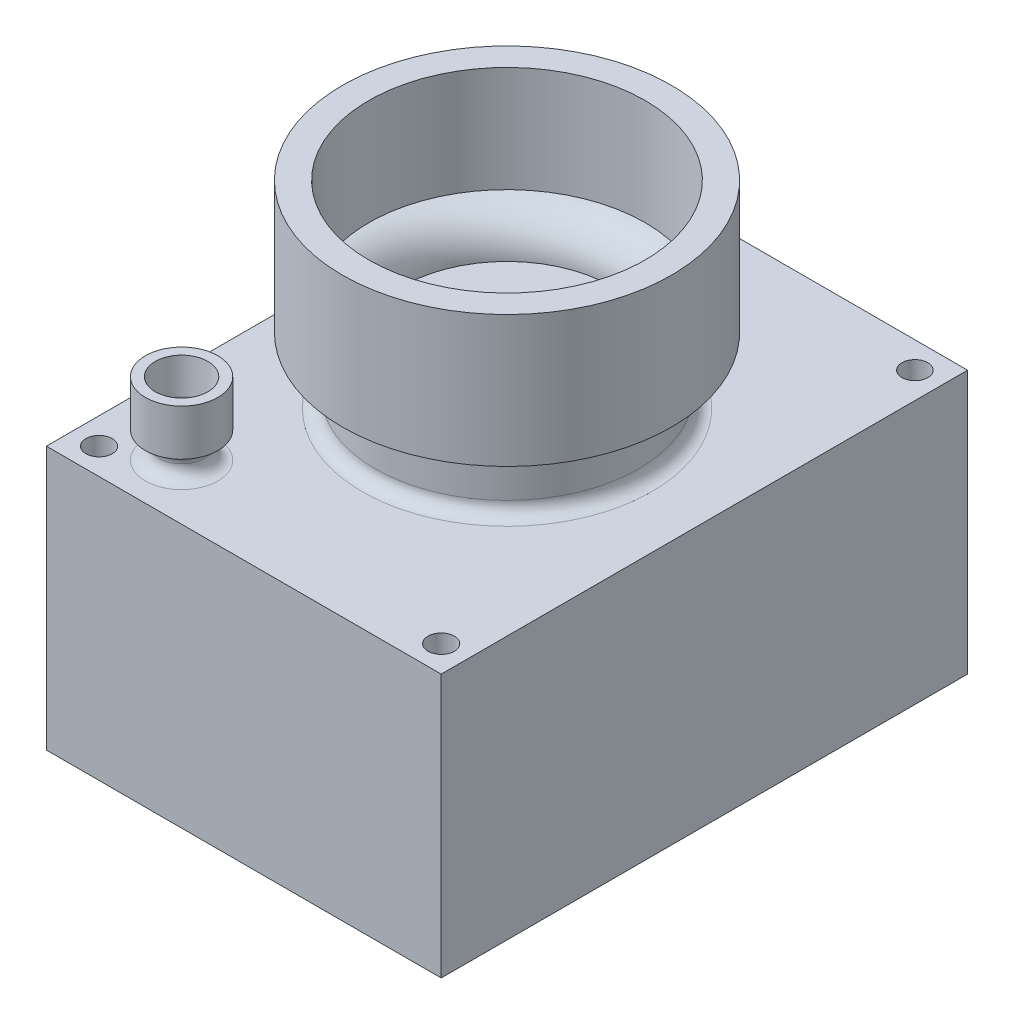
ISO-10303-21;
HEADER;
FILE_DESCRIPTION(('STEP AP214'),'2;1');
FILE_NAME('part.step','',(''),(''),'','','');
FILE_SCHEMA(('AUTOMOTIVE_DESIGN { 1 0 10303 214 1 1 1 1 }'));
ENDSEC;
DATA;
#1=APPLICATION_CONTEXT('core data for automotive mechanical design processes');
#2=APPLICATION_PROTOCOL_DEFINITION('international standard','automotive_design',2000,#1);
#3=PRODUCT_CONTEXT('',#1,'mechanical');
#4=PRODUCT('Part','Part','',(#3));
#5=PRODUCT_RELATED_PRODUCT_CATEGORY('part','',(#4));
#6=PRODUCT_DEFINITION_FORMATION('','',#4);
#7=PRODUCT_DEFINITION_CONTEXT('part definition',#1,'design');
#8=PRODUCT_DEFINITION('design','',#6,#7);
#9=PRODUCT_DEFINITION_SHAPE('','',#8);
#10=(LENGTH_UNIT() NAMED_UNIT(*) SI_UNIT(.MILLI.,.METRE.));
#11=(NAMED_UNIT(*) PLANE_ANGLE_UNIT() SI_UNIT($,.RADIAN.));
#12=(NAMED_UNIT(*) SI_UNIT($,.STERADIAN.) SOLID_ANGLE_UNIT());
#13=UNCERTAINTY_MEASURE_WITH_UNIT(LENGTH_MEASURE(1.E-05),#10,'distance_accuracy_value','');
#14=(GEOMETRIC_REPRESENTATION_CONTEXT(3) GLOBAL_UNCERTAINTY_ASSIGNED_CONTEXT((#13)) GLOBAL_UNIT_ASSIGNED_CONTEXT((#10,
#11,#12)) REPRESENTATION_CONTEXT('',''));
#15=CARTESIAN_POINT('',(0.,0.,0.));
#16=DIRECTION('',(0.,0.,1.));
#17=DIRECTION('',(1.,0.,0.));
#18=AXIS2_PLACEMENT_3D('',#15,#16,#17);
#19=CARTESIAN_POINT('',(0.,60.9600000947775,0.));
#20=DIRECTION('',(0.,-1.,0.));
#21=DIRECTION('',(0.,0.,-1.));
#22=AXIS2_PLACEMENT_3D('',#19,#20,#21);
#23=PLANE('',#22);
#24=CARTESIAN_POINT('',(0.,60.9600000947775,0.));
#25=DIRECTION('',(0.,-1.,0.));
#26=DIRECTION('',(0.,0.,-1.));
#27=AXIS2_PLACEMENT_3D('',#24,#25,#26);
#28=CIRCLE('',#27,20.32);
#29=CARTESIAN_POINT('',(0.,60.9600000947775,-20.32));
#30=VERTEX_POINT('',#29);
#31=EDGE_CURVE('E13',#30,#30,#28,.T.);
#32=ORIENTED_EDGE('',*,*,#31,.T.);
#33=EDGE_LOOP('',(#32));
#34=FACE_BOUND('',#33,.T.);
#35=ADVANCED_FACE('F49',(#34),#23,.T.);
#36=OPEN_SHELL('',(#35));
#37=SHELL_BASED_SURFACE_MODEL('B2',(#36));
#38=CARTESIAN_POINT('',(38.1,50.8,50.8));
#39=DIRECTION('',(-1.,0.,0.));
#40=DIRECTION('',(0.,0.,1.));
#41=AXIS2_PLACEMENT_3D('',#38,#39,#40);
#42=PLANE('',#41);
#43=DIRECTION('',(0.,0.,-1.));
#44=VECTOR('',#43,1.);
#45=CARTESIAN_POINT('',(38.1,0.,50.8));
#46=LINE('',#45,#44);
#47=CARTESIAN_POINT('',(38.1,0.,50.8));
#48=VERTEX_POINT('',#47);
#49=CARTESIAN_POINT('',(38.1,0.,-50.8));
#50=VERTEX_POINT('',#49);
#51=EDGE_CURVE('E208',#48,#50,#46,.T.);
#52=ORIENTED_EDGE('',*,*,#51,.T.);
#53=DIRECTION('',(0.,-1.,0.));
#54=VECTOR('',#53,1.);
#55=CARTESIAN_POINT('',(38.1,50.8,-50.8));
#56=LINE('',#55,#54);
#57=CARTESIAN_POINT('',(38.1,50.8,-50.8));
#58=VERTEX_POINT('',#57);
#59=EDGE_CURVE('E237',#58,#50,#56,.T.);
#60=ORIENTED_EDGE('',*,*,#59,.F.);
#61=DIRECTION('',(0.,0.,-1.));
#62=VECTOR('',#61,1.);
#63=CARTESIAN_POINT('',(38.1,50.8,50.8));
#64=LINE('',#63,#62);
#65=CARTESIAN_POINT('',(38.1,50.8,50.8));
#66=VERTEX_POINT('',#65);
#67=EDGE_CURVE('E211',#66,#58,#64,.T.);
#68=ORIENTED_EDGE('',*,*,#67,.F.);
#69=DIRECTION('',(0.,-1.,0.));
#70=VECTOR('',#69,1.);
#71=CARTESIAN_POINT('',(38.1,50.8,50.8));
#72=LINE('',#71,#70);
#73=EDGE_CURVE('E221',#66,#48,#72,.T.);
#74=ORIENTED_EDGE('',*,*,#73,.T.);
#75=EDGE_LOOP('',(#52,#60,#68,#74));
#76=FACE_BOUND('',#75,.T.);
#77=ADVANCED_FACE('F67',(#76),#42,.F.);
#78=CARTESIAN_POINT('',(-38.1,50.8,-50.8));
#79=DIRECTION('',(0.,0.,1.));
#80=DIRECTION('',(1.,0.,0.));
#81=AXIS2_PLACEMENT_3D('',#78,#79,#80);
#82=PLANE('',#81);
#83=DIRECTION('',(-1.,0.,0.));
#84=VECTOR('',#83,1.);
#85=CARTESIAN_POINT('',(-38.1,0.,-50.8));
#86=LINE('',#85,#84);
#87=CARTESIAN_POINT('',(-38.1,0.,-50.8));
#88=VERTEX_POINT('',#87);
#89=EDGE_CURVE('E224',#50,#88,#86,.T.);
#90=ORIENTED_EDGE('',*,*,#89,.T.);
#91=DIRECTION('',(0.,-1.,0.));
#92=VECTOR('',#91,1.);
#93=CARTESIAN_POINT('',(-38.1,50.8,-50.8));
#94=LINE('',#93,#92);
#95=CARTESIAN_POINT('',(-38.1,50.8,-50.8));
#96=VERTEX_POINT('',#95);
#97=EDGE_CURVE('E234',#96,#88,#94,.T.);
#98=ORIENTED_EDGE('',*,*,#97,.F.);
#99=DIRECTION('',(-1.,0.,0.));
#100=VECTOR('',#99,1.);
#101=CARTESIAN_POINT('',(-38.1,50.8,-50.8));
#102=LINE('',#101,#100);
#103=EDGE_CURVE('E214',#58,#96,#102,.T.);
#104=ORIENTED_EDGE('',*,*,#103,.F.);
#105=ORIENTED_EDGE('',*,*,#59,.T.);
#106=EDGE_LOOP('',(#90,#98,#104,#105));
#107=FACE_BOUND('',#106,.T.);
#108=ADVANCED_FACE('F279',(#107),#82,.F.);
#109=CARTESIAN_POINT('',(-38.1,50.8,50.8));
#110=DIRECTION('',(1.,0.,0.));
#111=DIRECTION('',(0.,0.,-1.));
#112=AXIS2_PLACEMENT_3D('',#109,#110,#111);
#113=PLANE('',#112);
#114=DIRECTION('',(0.,0.,1.));
#115=VECTOR('',#114,1.);
#116=CARTESIAN_POINT('',(-38.1,0.,50.8));
#117=LINE('',#116,#115);
#118=CARTESIAN_POINT('',(-38.1,0.,50.8));
#119=VERTEX_POINT('',#118);
#120=EDGE_CURVE('E226',#88,#119,#117,.T.);
#121=ORIENTED_EDGE('',*,*,#120,.T.);
#122=DIRECTION('',(0.,-1.,0.));
#123=VECTOR('',#122,1.);
#124=CARTESIAN_POINT('',(-38.1,50.8,50.8));
#125=LINE('',#124,#123);
#126=CARTESIAN_POINT('',(-38.1,50.8,50.8));
#127=VERTEX_POINT('',#126);
#128=EDGE_CURVE('E231',#127,#119,#125,.T.);
#129=ORIENTED_EDGE('',*,*,#128,.F.);
#130=DIRECTION('',(0.,0.,1.));
#131=VECTOR('',#130,1.);
#132=CARTESIAN_POINT('',(-38.1,50.8,50.8));
#133=LINE('',#132,#131);
#134=EDGE_CURVE('E217',#96,#127,#133,.T.);
#135=ORIENTED_EDGE('',*,*,#134,.F.);
#136=ORIENTED_EDGE('',*,*,#97,.T.);
#137=EDGE_LOOP('',(#121,#129,#135,#136));
#138=FACE_BOUND('',#137,.T.);
#139=ADVANCED_FACE('F286',(#138),#113,.F.);
#140=CARTESIAN_POINT('',(-38.1,50.8,50.8));
#141=DIRECTION('',(0.,0.,-1.));
#142=DIRECTION('',(-1.,0.,0.));
#143=AXIS2_PLACEMENT_3D('',#140,#141,#142);
#144=PLANE('',#143);
#145=DIRECTION('',(1.,0.,0.));
#146=VECTOR('',#145,1.);
#147=CARTESIAN_POINT('',(-38.1,0.,50.8));
#148=LINE('',#147,#146);
#149=EDGE_CURVE('E215',#119,#48,#148,.T.);
#150=ORIENTED_EDGE('',*,*,#149,.T.);
#151=ORIENTED_EDGE('',*,*,#73,.F.);
#152=DIRECTION('',(1.,0.,0.));
#153=VECTOR('',#152,1.);
#154=CARTESIAN_POINT('',(-38.1,50.8,50.8));
#155=LINE('',#154,#153);
#156=EDGE_CURVE('E219',#127,#66,#155,.T.);
#157=ORIENTED_EDGE('',*,*,#156,.F.);
#158=ORIENTED_EDGE('',*,*,#128,.T.);
#159=EDGE_LOOP('',(#150,#151,#157,#158));
#160=FACE_BOUND('',#159,.T.);
#161=ADVANCED_FACE('F400',(#160),#144,.F.);
#162=CARTESIAN_POINT('',(0.,50.8,0.));
#163=DIRECTION('',(0.,-1.,0.));
#164=DIRECTION('',(0.,0.,-1.));
#165=AXIS2_PLACEMENT_3D('',#162,#163,#164);
#166=PLANE('',#165);
#167=CARTESIAN_POINT('',(-22.7138732996143,50.8,40.0934278697737));
#168=DIRECTION('',(0.,-1.,0.));
#169=DIRECTION('',(0.,0.,-1.));
#170=AXIS2_PLACEMENT_3D('',#167,#168,#169);
#171=CIRCLE('',#170,6.985);
#172=CARTESIAN_POINT('',(-22.7138732996143,50.8,33.1084278697737));
#173=VERTEX_POINT('',#172);
#174=EDGE_CURVE('E261',#173,#173,#171,.T.);
#175=ORIENTED_EDGE('',*,*,#174,.T.);
#176=EDGE_LOOP('',(#175));
#177=FACE_BOUND('',#176,.T.);
#178=CARTESIAN_POINT('',(33.0128049647438,50.8,45.72));
#179=DIRECTION('',(0.,1.,0.));
#180=DIRECTION('',(0.,0.,1.));
#181=AXIS2_PLACEMENT_3D('',#178,#179,#180);
#182=CIRCLE('',#181,2.54);
#183=CARTESIAN_POINT('',(33.0128049647438,50.8,48.26));
#184=VERTEX_POINT('',#183);
#185=EDGE_CURVE('E321',#184,#184,#182,.T.);
#186=ORIENTED_EDGE('',*,*,#185,.F.);
#187=EDGE_LOOP('',(#186));
#188=FACE_BOUND('',#187,.T.);
#189=CARTESIAN_POINT('',(-33.02,50.8,45.72));
#190=DIRECTION('',(0.,1.,0.));
#191=DIRECTION('',(0.,0.,1.));
#192=AXIS2_PLACEMENT_3D('',#189,#190,#191);
#193=CIRCLE('',#192,2.54);
#194=CARTESIAN_POINT('',(-33.02,50.8,48.26));
#195=VERTEX_POINT('',#194);
#196=EDGE_CURVE('E333',#195,#195,#193,.T.);
#197=ORIENTED_EDGE('',*,*,#196,.F.);
#198=EDGE_LOOP('',(#197));
#199=FACE_BOUND('',#198,.T.);
#200=CARTESIAN_POINT('',(33.0128049647438,50.8,-45.72));
#201=DIRECTION('',(0.,1.,0.));
#202=DIRECTION('',(0.,0.,1.));
#203=AXIS2_PLACEMENT_3D('',#200,#201,#202);
#204=CIRCLE('',#203,2.49811005626827);
#205=CARTESIAN_POINT('',(33.0128049647438,50.8,-43.2218899437317));
#206=VERTEX_POINT('',#205);
#207=EDGE_CURVE('E344',#206,#206,#204,.T.);
#208=ORIENTED_EDGE('',*,*,#207,.F.);
#209=EDGE_LOOP('',(#208));
#210=FACE_BOUND('',#209,.T.);
#211=CARTESIAN_POINT('',(-33.02,50.8,-45.72));
#212=DIRECTION('',(0.,1.,0.));
#213=DIRECTION('',(0.,0.,1.));
#214=AXIS2_PLACEMENT_3D('',#211,#212,#213);
#215=CIRCLE('',#214,2.54);
#216=CARTESIAN_POINT('',(-33.02,50.8,-43.18));
#217=VERTEX_POINT('',#216);
#218=EDGE_CURVE('E357',#217,#217,#215,.T.);
#219=ORIENTED_EDGE('',*,*,#218,.F.);
#220=EDGE_LOOP('',(#219));
#221=FACE_BOUND('',#220,.T.);
#222=CARTESIAN_POINT('',(0.,50.8,0.));
#223=DIRECTION('',(0.,-1.,0.));
#224=DIRECTION('',(0.,0.,-1.));
#225=AXIS2_PLACEMENT_3D('',#222,#223,#224);
#226=CIRCLE('',#225,27.94);
#227=CARTESIAN_POINT('',(0.,50.8,-27.94));
#228=VERTEX_POINT('',#227);
#229=EDGE_CURVE('E243',#228,#228,#226,.T.);
#230=ORIENTED_EDGE('',*,*,#229,.T.);
#231=EDGE_LOOP('',(#230));
#232=FACE_BOUND('',#231,.T.);
#233=ORIENTED_EDGE('',*,*,#67,.T.);
#234=ORIENTED_EDGE('',*,*,#103,.T.);
#235=ORIENTED_EDGE('',*,*,#134,.T.);
#236=ORIENTED_EDGE('',*,*,#156,.T.);
#237=EDGE_LOOP('',(#233,#234,#235,#236));
#238=FACE_BOUND('',#237,.T.);
#239=ADVANCED_FACE('F396',(#177,#188,#199,#210,#221,#232,#238),#166,.F.);
#240=CARTESIAN_POINT('',(0.,0.,0.));
#241=DIRECTION('',(0.,-1.,0.));
#242=DIRECTION('',(0.,0.,-1.));
#243=AXIS2_PLACEMENT_3D('',#240,#241,#242);
#244=PLANE('',#243);
#245=CARTESIAN_POINT('',(33.0128049647438,0.,45.72));
#246=DIRECTION('',(0.,1.,0.));
#247=DIRECTION('',(0.,0.,1.));
#248=AXIS2_PLACEMENT_3D('',#245,#246,#247);
#249=CIRCLE('',#248,2.54);
#250=CARTESIAN_POINT('',(33.0128049647438,0.,48.26));
#251=VERTEX_POINT('',#250);
#252=EDGE_CURVE('E172',#251,#251,#249,.T.);
#253=ORIENTED_EDGE('',*,*,#252,.T.);
#254=EDGE_LOOP('',(#253));
#255=FACE_BOUND('',#254,.T.);
#256=CARTESIAN_POINT('',(-33.02,0.,45.72));
#257=DIRECTION('',(0.,1.,0.));
#258=DIRECTION('',(0.,0.,1.));
#259=AXIS2_PLACEMENT_3D('',#256,#257,#258);
#260=CIRCLE('',#259,2.54);
#261=CARTESIAN_POINT('',(-33.02,0.,48.26));
#262=VERTEX_POINT('',#261);
#263=EDGE_CURVE('E334',#262,#262,#260,.T.);
#264=ORIENTED_EDGE('',*,*,#263,.T.);
#265=EDGE_LOOP('',(#264));
#266=FACE_BOUND('',#265,.T.);
#267=CARTESIAN_POINT('',(33.0128049647438,0.,-45.72));
#268=DIRECTION('',(0.,1.,0.));
#269=DIRECTION('',(0.,0.,1.));
#270=AXIS2_PLACEMENT_3D('',#267,#268,#269);
#271=CIRCLE('',#270,2.49811005626827);
#272=CARTESIAN_POINT('',(33.0128049647438,0.,-43.2218899437317));
#273=VERTEX_POINT('',#272);
#274=EDGE_CURVE('E345',#273,#273,#271,.T.);
#275=ORIENTED_EDGE('',*,*,#274,.T.);
#276=EDGE_LOOP('',(#275));
#277=FACE_BOUND('',#276,.T.);
#278=CARTESIAN_POINT('',(-33.02,0.,-45.72));
#279=DIRECTION('',(0.,1.,0.));
#280=DIRECTION('',(0.,0.,1.));
#281=AXIS2_PLACEMENT_3D('',#278,#279,#280);
#282=CIRCLE('',#281,2.54);
#283=CARTESIAN_POINT('',(-33.02,0.,-43.18));
#284=VERTEX_POINT('',#283);
#285=EDGE_CURVE('E358',#284,#284,#282,.T.);
#286=ORIENTED_EDGE('',*,*,#285,.T.);
#287=EDGE_LOOP('',(#286));
#288=FACE_BOUND('',#287,.T.);
#289=ORIENTED_EDGE('',*,*,#51,.F.);
#290=ORIENTED_EDGE('',*,*,#149,.F.);
#291=ORIENTED_EDGE('',*,*,#120,.F.);
#292=ORIENTED_EDGE('',*,*,#89,.F.);
#293=EDGE_LOOP('',(#289,#290,#291,#292));
#294=FACE_BOUND('',#293,.T.);
#295=ADVANCED_FACE('F399',(#255,#266,#277,#288,#294),#244,.T.);
#296=CARTESIAN_POINT('',(0.,63.5,0.));
#297=DIRECTION('',(0.,-1.,0.));
#298=DIRECTION('',(0.,0.,-1.));
#299=AXIS2_PLACEMENT_3D('',#296,#297,#298);
#300=CYLINDRICAL_SURFACE('',#299,25.4);
#301=CARTESIAN_POINT('',(0.,60.96,0.));
#302=DIRECTION('',(0.,1.,0.));
#303=DIRECTION('',(0.,0.,1.));
#304=AXIS2_PLACEMENT_3D('',#301,#302,#303);
#305=CIRCLE('',#304,25.4);
#306=CARTESIAN_POINT('',(0.,60.96,25.4));
#307=VERTEX_POINT('',#306);
#308=EDGE_CURVE('E249',#307,#307,#305,.F.);
#309=ORIENTED_EDGE('',*,*,#308,.T.);
#310=EDGE_LOOP('',(#309));
#311=FACE_BOUND('',#310,.T.);
#312=CARTESIAN_POINT('',(0.,53.34,0.));
#313=DIRECTION('',(0.,-1.,0.));
#314=DIRECTION('',(0.,0.,-1.));
#315=AXIS2_PLACEMENT_3D('',#312,#313,#314);
#316=CIRCLE('',#315,25.4);
#317=CARTESIAN_POINT('',(0.,53.34,-25.4));
#318=VERTEX_POINT('',#317);
#319=EDGE_CURVE('E240',#318,#318,#316,.F.);
#320=ORIENTED_EDGE('',*,*,#319,.T.);
#321=EDGE_LOOP('',(#320));
#322=FACE_BOUND('',#321,.T.);
#323=ADVANCED_FACE('F423',(#311,#322),#300,.T.);
#324=CARTESIAN_POINT('',(0.,88.9,0.));
#325=DIRECTION('',(0.,-1.,0.));
#326=DIRECTION('',(0.,0.,-1.));
#327=AXIS2_PLACEMENT_3D('',#324,#325,#326);
#328=CYLINDRICAL_SURFACE('',#327,31.75);
#329=CARTESIAN_POINT('',(0.,88.9,0.));
#330=DIRECTION('',(0.,1.,0.));
#331=DIRECTION('',(0.,0.,1.));
#332=AXIS2_PLACEMENT_3D('',#329,#330,#331);
#333=CIRCLE('',#332,31.75);
#334=CARTESIAN_POINT('',(0.,88.9,31.75));
#335=VERTEX_POINT('',#334);
#336=EDGE_CURVE('E205',#335,#335,#333,.T.);
#337=ORIENTED_EDGE('',*,*,#336,.F.);
#338=EDGE_LOOP('',(#337));
#339=FACE_BOUND('',#338,.T.);
#340=CARTESIAN_POINT('',(0.,63.5,0.));
#341=DIRECTION('',(0.,1.,0.));
#342=DIRECTION('',(0.,0.,1.));
#343=AXIS2_PLACEMENT_3D('',#340,#341,#342);
#344=CIRCLE('',#343,31.75);
#345=CARTESIAN_POINT('',(0.,63.5,31.75));
#346=VERTEX_POINT('',#345);
#347=EDGE_CURVE('E197',#346,#346,#344,.T.);
#348=ORIENTED_EDGE('',*,*,#347,.T.);
#349=EDGE_LOOP('',(#348));
#350=FACE_BOUND('',#349,.T.);
#351=ADVANCED_FACE('F429',(#339,#350),#328,.T.);
#352=CARTESIAN_POINT('',(0.,88.9,0.));
#353=DIRECTION('',(0.,1.,0.));
#354=DIRECTION('',(0.,0.,1.));
#355=AXIS2_PLACEMENT_3D('',#352,#353,#354);
#356=PLANE('',#355);
#357=CARTESIAN_POINT('',(0.,88.9,0.));
#358=DIRECTION('',(0.,1.,0.));
#359=DIRECTION('',(0.,0.,1.));
#360=AXIS2_PLACEMENT_3D('',#357,#358,#359);
#361=CIRCLE('',#360,26.67);
#362=CARTESIAN_POINT('',(0.,88.9,26.67));
#363=VERTEX_POINT('',#362);
#364=EDGE_CURVE('E198',#363,#363,#361,.T.);
#365=ORIENTED_EDGE('',*,*,#364,.F.);
#366=EDGE_LOOP('',(#365));
#367=FACE_BOUND('',#366,.T.);
#368=ORIENTED_EDGE('',*,*,#336,.T.);
#369=EDGE_LOOP('',(#368));
#370=FACE_BOUND('',#369,.T.);
#371=ADVANCED_FACE('F472',(#367,#370),#356,.T.);
#372=CARTESIAN_POINT('',(0.,63.5,0.));
#373=DIRECTION('',(0.,1.,0.));
#374=DIRECTION('',(0.,0.,1.));
#375=AXIS2_PLACEMENT_3D('',#372,#373,#374);
#376=PLANE('',#375);
#377=CARTESIAN_POINT('',(0.,63.5,0.));
#378=DIRECTION('',(0.,1.,0.));
#379=DIRECTION('',(0.,0.,1.));
#380=AXIS2_PLACEMENT_3D('',#377,#378,#379);
#381=CIRCLE('',#380,27.94);
#382=CARTESIAN_POINT('',(0.,63.5,27.94));
#383=VERTEX_POINT('',#382);
#384=EDGE_CURVE('E246',#383,#383,#381,.T.);
#385=ORIENTED_EDGE('',*,*,#384,.T.);
#386=EDGE_LOOP('',(#385));
#387=FACE_BOUND('',#386,.T.);
#388=ORIENTED_EDGE('',*,*,#347,.F.);
#389=EDGE_LOOP('',(#388));
#390=FACE_BOUND('',#389,.T.);
#391=ADVANCED_FACE('F295',(#387,#390),#376,.F.);
#392=CARTESIAN_POINT('',(0.,53.34,0.));
#393=DIRECTION('',(0.,-1.,0.));
#394=DIRECTION('',(0.,0.,-1.));
#395=AXIS2_PLACEMENT_3D('',#392,#393,#394);
#396=TOROIDAL_SURFACE('',#395,27.94,2.54);
#397=ORIENTED_EDGE('',*,*,#229,.F.);
#398=EDGE_LOOP('',(#397));
#399=FACE_BOUND('',#398,.T.);
#400=ORIENTED_EDGE('',*,*,#319,.F.);
#401=EDGE_LOOP('',(#400));
#402=FACE_BOUND('',#401,.T.);
#403=ADVANCED_FACE('F291',(#399,#402),#396,.F.);
#404=CARTESIAN_POINT('',(0.,60.96,0.));
#405=DIRECTION('',(0.,1.,0.));
#406=DIRECTION('',(0.,0.,1.));
#407=AXIS2_PLACEMENT_3D('',#404,#405,#406);
#408=TOROIDAL_SURFACE('',#407,27.94,2.54);
#409=ORIENTED_EDGE('',*,*,#308,.F.);
#410=EDGE_LOOP('',(#409));
#411=FACE_BOUND('',#410,.T.);
#412=ORIENTED_EDGE('',*,*,#384,.F.);
#413=EDGE_LOOP('',(#412));
#414=FACE_BOUND('',#413,.T.);
#415=ADVANCED_FACE('F294',(#411,#414),#408,.F.);
#416=CARTESIAN_POINT('',(33.02,50.8,50.8));
#417=DIRECTION('',(-1.,0.,0.));
#418=DIRECTION('',(0.,0.,1.));
#419=AXIS2_PLACEMENT_3D('',#416,#417,#418);
#420=PLANE('',#419);
#421=DIRECTION('',(0.,1.,0.));
#422=VECTOR('',#421,1.);
#423=CARTESIAN_POINT('',(33.02,0.,43.1800101906764));
#424=LINE('',#423,#422);
#425=CARTESIAN_POINT('',(33.02,45.72,43.1800101906764));
#426=VERTEX_POINT('',#425);
#427=CARTESIAN_POINT('',(33.02,5.08,43.1800101906764));
#428=VERTEX_POINT('',#427);
#429=EDGE_CURVE('E82',#426,#428,#424,.F.);
#430=ORIENTED_EDGE('',*,*,#429,.F.);
#431=DIRECTION('',(0.,0.,-1.));
#432=VECTOR('',#431,1.);
#433=CARTESIAN_POINT('',(33.02,45.72,0.));
#434=LINE('',#433,#432);
#435=CARTESIAN_POINT('',(33.02,45.72,-43.2219003052928));
#436=VERTEX_POINT('',#435);
#437=EDGE_CURVE('E176',#426,#436,#434,.T.);
#438=ORIENTED_EDGE('',*,*,#437,.T.);
#439=DIRECTION('',(0.,1.,0.));
#440=VECTOR('',#439,1.);
#441=CARTESIAN_POINT('',(33.02,0.,-43.2219003052928));
#442=LINE('',#441,#440);
#443=CARTESIAN_POINT('',(33.02,5.08,-43.2219003052928));
#444=VERTEX_POINT('',#443);
#445=EDGE_CURVE('E352',#444,#436,#442,.T.);
#446=ORIENTED_EDGE('',*,*,#445,.F.);
#447=DIRECTION('',(0.,0.,-1.));
#448=VECTOR('',#447,1.);
#449=CARTESIAN_POINT('',(33.02,5.08,0.));
#450=LINE('',#449,#448);
#451=EDGE_CURVE('E201',#428,#444,#450,.T.);
#452=ORIENTED_EDGE('',*,*,#451,.F.);
#453=EDGE_LOOP('',(#430,#438,#446,#452));
#454=FACE_BOUND('',#453,.T.);
#455=ADVANCED_FACE('F299',(#454),#420,.T.);
#456=CARTESIAN_POINT('',(-38.1,50.8,-45.72));
#457=DIRECTION('',(0.,0.,1.));
#458=DIRECTION('',(1.,0.,0.));
#459=AXIS2_PLACEMENT_3D('',#456,#457,#458);
#460=PLANE('',#459);
#461=DIRECTION('',(0.,1.,0.));
#462=VECTOR('',#461,1.);
#463=CARTESIAN_POINT('',(30.5146949084756,0.,-45.72));
#464=LINE('',#463,#462);
#465=CARTESIAN_POINT('',(30.5146949084756,45.72,-45.72));
#466=VERTEX_POINT('',#465);
#467=CARTESIAN_POINT('',(30.5146949084756,5.08,-45.72));
#468=VERTEX_POINT('',#467);
#469=EDGE_CURVE('E348',#466,#468,#464,.F.);
#470=ORIENTED_EDGE('',*,*,#469,.F.);
#471=DIRECTION('',(-1.,0.,0.));
#472=VECTOR('',#471,1.);
#473=CARTESIAN_POINT('',(0.,45.72,-45.72));
#474=LINE('',#473,#472);
#475=CARTESIAN_POINT('',(-30.48,45.72,-45.72));
#476=VERTEX_POINT('',#475);
#477=EDGE_CURVE('E179',#466,#476,#474,.T.);
#478=ORIENTED_EDGE('',*,*,#477,.T.);
#479=DIRECTION('',(0.,1.,0.));
#480=VECTOR('',#479,1.);
#481=CARTESIAN_POINT('',(-30.48,0.,-45.72));
#482=LINE('',#481,#480);
#483=CARTESIAN_POINT('',(-30.48,5.08,-45.72));
#484=VERTEX_POINT('',#483);
#485=EDGE_CURVE('E365',#484,#476,#482,.T.);
#486=ORIENTED_EDGE('',*,*,#485,.F.);
#487=DIRECTION('',(-1.,0.,0.));
#488=VECTOR('',#487,1.);
#489=CARTESIAN_POINT('',(0.,5.08,-45.72));
#490=LINE('',#489,#488);
#491=EDGE_CURVE('E181',#468,#484,#490,.T.);
#492=ORIENTED_EDGE('',*,*,#491,.F.);
#493=EDGE_LOOP('',(#470,#478,#486,#492));
#494=FACE_BOUND('',#493,.T.);
#495=ADVANCED_FACE('F502',(#494),#460,.T.);
#496=CARTESIAN_POINT('',(-33.02,50.8,50.8));
#497=DIRECTION('',(1.,0.,0.));
#498=DIRECTION('',(0.,0.,-1.));
#499=AXIS2_PLACEMENT_3D('',#496,#497,#498);
#500=PLANE('',#499);
#501=DIRECTION('',(0.,1.,0.));
#502=VECTOR('',#501,1.);
#503=CARTESIAN_POINT('',(-33.02,0.,43.18));
#504=LINE('',#503,#502);
#505=CARTESIAN_POINT('',(-33.02,5.08,43.18));
#506=VERTEX_POINT('',#505);
#507=CARTESIAN_POINT('',(-33.02,45.72,43.18));
#508=VERTEX_POINT('',#507);
#509=EDGE_CURVE('E340',#506,#508,#504,.T.);
#510=ORIENTED_EDGE('',*,*,#509,.F.);
#511=DIRECTION('',(0.,0.,1.));
#512=VECTOR('',#511,1.);
#513=CARTESIAN_POINT('',(-33.02,5.08,0.));
#514=LINE('',#513,#512);
#515=CARTESIAN_POINT('',(-33.02,5.08,-43.18));
#516=VERTEX_POINT('',#515);
#517=EDGE_CURVE('E177',#516,#506,#514,.T.);
#518=ORIENTED_EDGE('',*,*,#517,.F.);
#519=DIRECTION('',(0.,1.,0.));
#520=VECTOR('',#519,1.);
#521=CARTESIAN_POINT('',(-33.02,0.,-43.18));
#522=LINE('',#521,#520);
#523=CARTESIAN_POINT('',(-33.02,45.72,-43.18));
#524=VERTEX_POINT('',#523);
#525=EDGE_CURVE('E361',#524,#516,#522,.F.);
#526=ORIENTED_EDGE('',*,*,#525,.F.);
#527=DIRECTION('',(0.,0.,1.));
#528=VECTOR('',#527,1.);
#529=CARTESIAN_POINT('',(-33.02,45.72,0.));
#530=LINE('',#529,#528);
#531=EDGE_CURVE('E185',#524,#508,#530,.T.);
#532=ORIENTED_EDGE('',*,*,#531,.T.);
#533=EDGE_LOOP('',(#510,#518,#526,#532));
#534=FACE_BOUND('',#533,.T.);
#535=ADVANCED_FACE('F380',(#534),#500,.T.);
#536=CARTESIAN_POINT('',(-38.1,50.8,45.72));
#537=DIRECTION('',(0.,0.,-1.));
#538=DIRECTION('',(-1.,0.,0.));
#539=AXIS2_PLACEMENT_3D('',#536,#537,#538);
#540=PLANE('',#539);
#541=DIRECTION('',(0.,1.,0.));
#542=VECTOR('',#541,1.);
#543=CARTESIAN_POINT('',(30.4728049647438,0.,45.72));
#544=LINE('',#543,#542);
#545=CARTESIAN_POINT('',(30.4728049647438,5.08,45.72));
#546=VERTEX_POINT('',#545);
#547=CARTESIAN_POINT('',(30.4728049647438,45.72,45.72));
#548=VERTEX_POINT('',#547);
#549=EDGE_CURVE('E157',#546,#548,#544,.T.);
#550=ORIENTED_EDGE('',*,*,#549,.F.);
#551=DIRECTION('',(1.,0.,0.));
#552=VECTOR('',#551,1.);
#553=CARTESIAN_POINT('',(0.,5.08,45.72));
#554=LINE('',#553,#552);
#555=CARTESIAN_POINT('',(-30.48,5.08,45.72));
#556=VERTEX_POINT('',#555);
#557=EDGE_CURVE('E169',#556,#546,#554,.T.);
#558=ORIENTED_EDGE('',*,*,#557,.F.);
#559=DIRECTION('',(0.,1.,0.));
#560=VECTOR('',#559,1.);
#561=CARTESIAN_POINT('',(-30.48,0.,45.72));
#562=LINE('',#561,#560);
#563=CARTESIAN_POINT('',(-30.48,45.72,45.72));
#564=VERTEX_POINT('',#563);
#565=EDGE_CURVE('E90',#564,#556,#562,.F.);
#566=ORIENTED_EDGE('',*,*,#565,.F.);
#567=DIRECTION('',(1.,0.,0.));
#568=VECTOR('',#567,1.);
#569=CARTESIAN_POINT('',(0.,45.72,45.72));
#570=LINE('',#569,#568);
#571=EDGE_CURVE('E171',#564,#548,#570,.T.);
#572=ORIENTED_EDGE('',*,*,#571,.T.);
#573=EDGE_LOOP('',(#550,#558,#566,#572));
#574=FACE_BOUND('',#573,.T.);
#575=ADVANCED_FACE('F168',(#574),#540,.T.);
#576=CARTESIAN_POINT('',(0.,45.72,0.));
#577=DIRECTION('',(0.,-1.,0.));
#578=DIRECTION('',(0.,0.,-1.));
#579=AXIS2_PLACEMENT_3D('',#576,#577,#578);
#580=PLANE('',#579);
#581=CARTESIAN_POINT('',(33.0128049647438,45.72,45.72));
#582=DIRECTION('',(0.,-1.,0.));
#583=DIRECTION('',(0.,0.,-1.));
#584=AXIS2_PLACEMENT_3D('',#581,#582,#583);
#585=CIRCLE('',#584,2.54);
#586=EDGE_CURVE('E331',#548,#426,#585,.T.);
#587=ORIENTED_EDGE('',*,*,#586,.F.);
#588=ORIENTED_EDGE('',*,*,#571,.F.);
#589=CARTESIAN_POINT('',(-33.02,45.72,45.72));
#590=DIRECTION('',(0.,-1.,0.));
#591=DIRECTION('',(0.,0.,-1.));
#592=AXIS2_PLACEMENT_3D('',#589,#590,#591);
#593=CIRCLE('',#592,2.54);
#594=EDGE_CURVE('E342',#508,#564,#593,.T.);
#595=ORIENTED_EDGE('',*,*,#594,.F.);
#596=ORIENTED_EDGE('',*,*,#531,.F.);
#597=CARTESIAN_POINT('',(-33.02,45.72,-45.72));
#598=DIRECTION('',(0.,-1.,0.));
#599=DIRECTION('',(0.,0.,-1.));
#600=AXIS2_PLACEMENT_3D('',#597,#598,#599);
#601=CIRCLE('',#600,2.54);
#602=EDGE_CURVE('E202',#476,#524,#601,.T.);
#603=ORIENTED_EDGE('',*,*,#602,.F.);
#604=ORIENTED_EDGE('',*,*,#477,.F.);
#605=CARTESIAN_POINT('',(33.0128049647438,45.72,-45.72));
#606=DIRECTION('',(0.,-1.,0.));
#607=DIRECTION('',(0.,0.,-1.));
#608=AXIS2_PLACEMENT_3D('',#605,#606,#607);
#609=CIRCLE('',#608,2.49811005626827);
#610=EDGE_CURVE('E355',#436,#466,#609,.T.);
#611=ORIENTED_EDGE('',*,*,#610,.F.);
#612=ORIENTED_EDGE('',*,*,#437,.F.);
#613=EDGE_LOOP('',(#587,#588,#595,#596,#603,#604,#611,#612));
#614=FACE_BOUND('',#613,.T.);
#615=CARTESIAN_POINT('',(0.,45.72,0.));
#616=DIRECTION('',(0.,-1.,0.));
#617=DIRECTION('',(0.,0.,-1.));
#618=AXIS2_PLACEMENT_3D('',#615,#616,#617);
#619=CIRCLE('',#618,27.94);
#620=CARTESIAN_POINT('',(0.,45.72,-27.94));
#621=VERTEX_POINT('',#620);
#622=EDGE_CURVE('E188',#621,#621,#619,.T.);
#623=ORIENTED_EDGE('',*,*,#622,.F.);
#624=EDGE_LOOP('',(#623));
#625=FACE_BOUND('',#624,.T.);
#626=ADVANCED_FACE('F385',(#614,#625),#580,.T.);
#627=CARTESIAN_POINT('',(0.,5.08,0.));
#628=DIRECTION('',(0.,-1.,0.));
#629=DIRECTION('',(0.,0.,-1.));
#630=AXIS2_PLACEMENT_3D('',#627,#628,#629);
#631=PLANE('',#630);
#632=ORIENTED_EDGE('',*,*,#557,.T.);
#633=CARTESIAN_POINT('',(33.0128049647438,5.08,45.72));
#634=DIRECTION('',(0.,-1.,0.));
#635=DIRECTION('',(0.,0.,-1.));
#636=AXIS2_PLACEMENT_3D('',#633,#634,#635);
#637=CIRCLE('',#636,2.54);
#638=EDGE_CURVE('E153',#546,#428,#637,.T.);
#639=ORIENTED_EDGE('',*,*,#638,.T.);
#640=ORIENTED_EDGE('',*,*,#451,.T.);
#641=CARTESIAN_POINT('',(33.0128049647438,5.08,-45.72));
#642=DIRECTION('',(0.,-1.,0.));
#643=DIRECTION('',(0.,0.,-1.));
#644=AXIS2_PLACEMENT_3D('',#641,#642,#643);
#645=CIRCLE('',#644,2.49811005626827);
#646=EDGE_CURVE('E255',#444,#468,#645,.T.);
#647=ORIENTED_EDGE('',*,*,#646,.T.);
#648=ORIENTED_EDGE('',*,*,#491,.T.);
#649=CARTESIAN_POINT('',(-33.02,5.08,-45.72));
#650=DIRECTION('',(0.,-1.,0.));
#651=DIRECTION('',(0.,0.,-1.));
#652=AXIS2_PLACEMENT_3D('',#649,#650,#651);
#653=CIRCLE('',#652,2.54);
#654=EDGE_CURVE('E252',#484,#516,#653,.T.);
#655=ORIENTED_EDGE('',*,*,#654,.T.);
#656=ORIENTED_EDGE('',*,*,#517,.T.);
#657=CARTESIAN_POINT('',(-33.02,5.08,45.72));
#658=DIRECTION('',(0.,-1.,0.));
#659=DIRECTION('',(0.,0.,-1.));
#660=AXIS2_PLACEMENT_3D('',#657,#658,#659);
#661=CIRCLE('',#660,2.54);
#662=EDGE_CURVE('E163',#506,#556,#661,.T.);
#663=ORIENTED_EDGE('',*,*,#662,.T.);
#664=EDGE_LOOP('',(#632,#639,#640,#647,#648,#655,#656,#663));
#665=FACE_BOUND('',#664,.T.);
#666=ADVANCED_FACE('F174',(#665),#631,.F.);
#667=CARTESIAN_POINT('',(0.,63.5,0.));
#668=DIRECTION('',(0.,-1.,0.));
#669=DIRECTION('',(0.,0.,-1.));
#670=AXIS2_PLACEMENT_3D('',#667,#668,#669);
#671=CYLINDRICAL_SURFACE('',#670,20.32);
#672=CARTESIAN_POINT('',(0.,60.96,0.));
#673=DIRECTION('',(0.,-1.,0.));
#674=DIRECTION('',(0.,0.,-1.));
#675=AXIS2_PLACEMENT_3D('',#672,#673,#674);
#676=CIRCLE('',#675,20.32);
#677=CARTESIAN_POINT('',(0.,60.96,-20.32));
#678=VERTEX_POINT('',#677);
#679=EDGE_CURVE('E194',#678,#678,#676,.T.);
#680=ORIENTED_EDGE('',*,*,#679,.F.);
#681=EDGE_LOOP('',(#680));
#682=FACE_BOUND('',#681,.T.);
#683=CARTESIAN_POINT('',(0.,53.34,0.));
#684=DIRECTION('',(0.,-1.,0.));
#685=DIRECTION('',(0.,0.,-1.));
#686=AXIS2_PLACEMENT_3D('',#683,#684,#685);
#687=CIRCLE('',#686,20.32);
#688=CARTESIAN_POINT('',(0.,53.34,-20.32));
#689=VERTEX_POINT('',#688);
#690=EDGE_CURVE('E187',#689,#689,#687,.F.);
#691=ORIENTED_EDGE('',*,*,#690,.F.);
#692=EDGE_LOOP('',(#691));
#693=FACE_BOUND('',#692,.T.);
#694=ADVANCED_FACE('F534',(#682,#693),#671,.F.);
#695=CARTESIAN_POINT('',(0.,88.9,0.));
#696=DIRECTION('',(0.,-1.,0.));
#697=DIRECTION('',(0.,0.,-1.));
#698=AXIS2_PLACEMENT_3D('',#695,#696,#697);
#699=CYLINDRICAL_SURFACE('',#698,26.67);
#700=ORIENTED_EDGE('',*,*,#364,.T.);
#701=EDGE_LOOP('',(#700));
#702=FACE_BOUND('',#701,.T.);
#703=CARTESIAN_POINT('',(0.,68.4734213245365,0.));
#704=DIRECTION('',(0.,-1.,0.));
#705=DIRECTION('',(0.,0.,-1.));
#706=AXIS2_PLACEMENT_3D('',#703,#704,#705);
#707=CIRCLE('',#706,26.67);
#708=CARTESIAN_POINT('',(0.,68.4734213245365,-26.67));
#709=VERTEX_POINT('',#708);
#710=EDGE_CURVE('E191',#709,#709,#707,.F.);
#711=ORIENTED_EDGE('',*,*,#710,.F.);
#712=EDGE_LOOP('',(#711));
#713=FACE_BOUND('',#712,.T.);
#714=ADVANCED_FACE('F541',(#702,#713),#699,.F.);
#715=CARTESIAN_POINT('',(0.,53.34,0.));
#716=DIRECTION('',(0.,-1.,0.));
#717=DIRECTION('',(0.,0.,-1.));
#718=AXIS2_PLACEMENT_3D('',#715,#716,#717);
#719=TOROIDAL_SURFACE('',#718,27.94,7.62);
#720=ORIENTED_EDGE('',*,*,#622,.T.);
#721=EDGE_LOOP('',(#720));
#722=FACE_BOUND('',#721,.T.);
#723=ORIENTED_EDGE('',*,*,#690,.T.);
#724=EDGE_LOOP('',(#723));
#725=FACE_BOUND('',#724,.T.);
#726=ADVANCED_FACE('F549',(#722,#725),#719,.T.);
#727=CARTESIAN_POINT('',(0.,60.96,0.));
#728=DIRECTION('',(0.,1.,0.));
#729=DIRECTION('',(0.,0.,1.));
#730=AXIS2_PLACEMENT_3D('',#727,#728,#729);
#731=TOROIDAL_SURFACE('',#730,27.94,7.62);
#732=ORIENTED_EDGE('',*,*,#679,.T.);
#733=EDGE_LOOP('',(#732));
#734=FACE_BOUND('',#733,.T.);
#735=ORIENTED_EDGE('',*,*,#710,.T.);
#736=EDGE_LOOP('',(#735));
#737=FACE_BOUND('',#736,.T.);
#738=ADVANCED_FACE('F557',(#734,#737),#731,.T.);
#739=CARTESIAN_POINT('',(-33.02,0.,-45.72));
#740=DIRECTION('',(0.,1.,0.));
#741=DIRECTION('',(0.,0.,1.));
#742=AXIS2_PLACEMENT_3D('',#739,#740,#741);
#743=CYLINDRICAL_SURFACE('',#742,2.54);
#744=ORIENTED_EDGE('',*,*,#602,.T.);
#745=ORIENTED_EDGE('',*,*,#525,.T.);
#746=ORIENTED_EDGE('',*,*,#654,.F.);
#747=ORIENTED_EDGE('',*,*,#485,.T.);
#748=EDGE_LOOP('',(#744,#745,#746,#747));
#749=FACE_BOUND('',#748,.T.);
#750=ORIENTED_EDGE('',*,*,#285,.F.);
#751=EDGE_LOOP('',(#750));
#752=FACE_BOUND('',#751,.T.);
#753=ORIENTED_EDGE('',*,*,#218,.T.);
#754=EDGE_LOOP('',(#753));
#755=FACE_BOUND('',#754,.T.);
#756=ADVANCED_FACE('F564',(#749,#752,#755),#743,.F.);
#757=CARTESIAN_POINT('',(33.0128049647438,0.,-45.72));
#758=DIRECTION('',(0.,1.,0.));
#759=DIRECTION('',(0.,0.,1.));
#760=AXIS2_PLACEMENT_3D('',#757,#758,#759);
#761=CYLINDRICAL_SURFACE('',#760,2.49811005626827);
#762=ORIENTED_EDGE('',*,*,#610,.T.);
#763=ORIENTED_EDGE('',*,*,#469,.T.);
#764=ORIENTED_EDGE('',*,*,#646,.F.);
#765=ORIENTED_EDGE('',*,*,#445,.T.);
#766=EDGE_LOOP('',(#762,#763,#764,#765));
#767=FACE_BOUND('',#766,.T.);
#768=ORIENTED_EDGE('',*,*,#274,.F.);
#769=EDGE_LOOP('',(#768));
#770=FACE_BOUND('',#769,.T.);
#771=ORIENTED_EDGE('',*,*,#207,.T.);
#772=EDGE_LOOP('',(#771));
#773=FACE_BOUND('',#772,.T.);
#774=ADVANCED_FACE('F390',(#767,#770,#773),#761,.F.);
#775=CARTESIAN_POINT('',(-33.02,0.,45.72));
#776=DIRECTION('',(0.,1.,0.));
#777=DIRECTION('',(0.,0.,1.));
#778=AXIS2_PLACEMENT_3D('',#775,#776,#777);
#779=CYLINDRICAL_SURFACE('',#778,2.54);
#780=ORIENTED_EDGE('',*,*,#594,.T.);
#781=ORIENTED_EDGE('',*,*,#565,.T.);
#782=ORIENTED_EDGE('',*,*,#662,.F.);
#783=ORIENTED_EDGE('',*,*,#509,.T.);
#784=EDGE_LOOP('',(#780,#781,#782,#783));
#785=FACE_BOUND('',#784,.T.);
#786=ORIENTED_EDGE('',*,*,#263,.F.);
#787=EDGE_LOOP('',(#786));
#788=FACE_BOUND('',#787,.T.);
#789=ORIENTED_EDGE('',*,*,#196,.T.);
#790=EDGE_LOOP('',(#789));
#791=FACE_BOUND('',#790,.T.);
#792=ADVANCED_FACE('F387',(#785,#788,#791),#779,.F.);
#793=CARTESIAN_POINT('',(33.0128049647438,0.,45.72));
#794=DIRECTION('',(0.,1.,0.));
#795=DIRECTION('',(0.,0.,1.));
#796=AXIS2_PLACEMENT_3D('',#793,#794,#795);
#797=CYLINDRICAL_SURFACE('',#796,2.54);
#798=ORIENTED_EDGE('',*,*,#586,.T.);
#799=ORIENTED_EDGE('',*,*,#429,.T.);
#800=ORIENTED_EDGE('',*,*,#638,.F.);
#801=ORIENTED_EDGE('',*,*,#549,.T.);
#802=EDGE_LOOP('',(#798,#799,#800,#801));
#803=FACE_BOUND('',#802,.T.);
#804=ORIENTED_EDGE('',*,*,#252,.F.);
#805=EDGE_LOOP('',(#804));
#806=FACE_BOUND('',#805,.T.);
#807=ORIENTED_EDGE('',*,*,#185,.T.);
#808=EDGE_LOOP('',(#807));
#809=FACE_BOUND('',#808,.T.);
#810=ADVANCED_FACE('F155',(#803,#806,#809),#797,.F.);
#811=CARTESIAN_POINT('',(-22.7138732996143,64.77,40.0934278697737));
#812=DIRECTION('',(0.,-1.,0.));
#813=DIRECTION('',(0.,0.,-1.));
#814=AXIS2_PLACEMENT_3D('',#811,#812,#813);
#815=CYLINDRICAL_SURFACE('',#814,6.985);
#816=CARTESIAN_POINT('',(-22.7138732996143,64.77,40.0934278697737));
#817=DIRECTION('',(0.,1.,0.));
#818=DIRECTION('',(0.,0.,1.));
#819=AXIS2_PLACEMENT_3D('',#816,#817,#818);
#820=CIRCLE('',#819,6.985);
#821=CARTESIAN_POINT('',(-22.7138732996143,64.77,47.0784278697737));
#822=VERTEX_POINT('',#821);
#823=EDGE_CURVE('E317',#822,#822,#820,.T.);
#824=ORIENTED_EDGE('',*,*,#823,.F.);
#825=EDGE_LOOP('',(#824));
#826=FACE_BOUND('',#825,.T.);
#827=CARTESIAN_POINT('',(-22.7138732996143,55.88,40.0934278697737));
#828=DIRECTION('',(0.,1.,0.));
#829=DIRECTION('',(0.,0.,1.));
#830=AXIS2_PLACEMENT_3D('',#827,#828,#829);
#831=CIRCLE('',#830,6.985);
#832=CARTESIAN_POINT('',(-22.7138732996143,55.88,47.0784278697737));
#833=VERTEX_POINT('',#832);
#834=EDGE_CURVE('E315',#833,#833,#831,.T.);
#835=ORIENTED_EDGE('',*,*,#834,.T.);
#836=EDGE_LOOP('',(#835));
#837=FACE_BOUND('',#836,.T.);
#838=ADVANCED_FACE('F589',(#826,#837),#815,.T.);
#839=CARTESIAN_POINT('',(-22.7138732996143,64.77,40.0934278697737));
#840=DIRECTION('',(0.,1.,0.));
#841=DIRECTION('',(0.,0.,1.));
#842=AXIS2_PLACEMENT_3D('',#839,#840,#841);
#843=PLANE('',#842);
#844=CARTESIAN_POINT('',(-22.7138732996143,64.77,40.0934278697737));
#845=DIRECTION('',(0.,1.,0.));
#846=DIRECTION('',(0.,0.,1.));
#847=AXIS2_PLACEMENT_3D('',#844,#845,#846);
#848=CIRCLE('',#847,5.08);
#849=CARTESIAN_POINT('',(-22.7138732996143,64.77,45.1734278697737));
#850=VERTEX_POINT('',#849);
#851=EDGE_CURVE('E318',#850,#850,#848,.T.);
#852=ORIENTED_EDGE('',*,*,#851,.F.);
#853=EDGE_LOOP('',(#852));
#854=FACE_BOUND('',#853,.T.);
#855=ORIENTED_EDGE('',*,*,#823,.T.);
#856=EDGE_LOOP('',(#855));
#857=FACE_BOUND('',#856,.T.);
#858=ADVANCED_FACE('F596',(#854,#857),#843,.T.);
#859=CARTESIAN_POINT('',(-22.7138732996143,64.77,40.0934278697737));
#860=DIRECTION('',(0.,1.,0.));
#861=DIRECTION('',(0.,0.,1.));
#862=AXIS2_PLACEMENT_3D('',#859,#860,#861);
#863=CONICAL_SURFACE('',#862,5.08,0.0872664625997165);
#864=CARTESIAN_POINT('',(-22.7138732996143,58.198624413421,40.0934278697737));
#865=DIRECTION('',(0.,-1.,0.));
#866=DIRECTION('',(0.,0.,-1.));
#867=AXIS2_PLACEMENT_3D('',#864,#865,#866);
#868=CIRCLE('',#867,4.50507913240332);
#869=CARTESIAN_POINT('',(-22.7138732996143,58.198624413421,35.5883487373704));
#870=VERTEX_POINT('',#869);
#871=EDGE_CURVE('E47',#870,#870,#868,.T.);
#872=ORIENTED_EDGE('',*,*,#871,.T.);
#873=EDGE_LOOP('',(#872));
#874=FACE_BOUND('',#873,.T.);
#875=ORIENTED_EDGE('',*,*,#851,.T.);
#876=EDGE_LOOP('',(#875));
#877=FACE_BOUND('',#876,.T.);
#878=ADVANCED_FACE('F307',(#874,#877),#863,.F.);
#879=CARTESIAN_POINT('',(-22.7138732996143,55.88,40.0934278697737));
#880=DIRECTION('',(0.,1.,0.));
#881=DIRECTION('',(0.,0.,1.));
#882=AXIS2_PLACEMENT_3D('',#879,#880,#881);
#883=PLANE('',#882);
#884=CARTESIAN_POINT('',(-22.7138732996143,55.88,40.0934278697737));
#885=DIRECTION('',(0.,1.,0.));
#886=DIRECTION('',(0.,0.,1.));
#887=AXIS2_PLACEMENT_3D('',#884,#885,#886);
#888=CIRCLE('',#887,1.97474459925028);
#889=CARTESIAN_POINT('',(-22.7138732996143,55.88,42.068172469024));
#890=VERTEX_POINT('',#889);
#891=EDGE_CURVE('E75',#890,#890,#888,.T.);
#892=ORIENTED_EDGE('',*,*,#891,.T.);
#893=EDGE_LOOP('',(#892));
#894=FACE_BOUND('',#893,.T.);
#895=ADVANCED_FACE('F266',(#894),#883,.T.);
#896=CARTESIAN_POINT('',(-22.7138732996143,53.34,40.0934278697737));
#897=DIRECTION('',(0.,-1.,0.));
#898=DIRECTION('',(0.,0.,-1.));
#899=AXIS2_PLACEMENT_3D('',#896,#897,#898);
#900=TOROIDAL_SURFACE('',#899,6.985,2.54);
#901=ORIENTED_EDGE('',*,*,#174,.F.);
#902=EDGE_LOOP('',(#901));
#903=FACE_BOUND('',#902,.T.);
#904=CARTESIAN_POINT('',(-22.7138732996143,53.34,40.0934278697737));
#905=DIRECTION('',(0.,-1.,0.));
#906=DIRECTION('',(0.,0.,-1.));
#907=AXIS2_PLACEMENT_3D('',#904,#905,#906);
#908=CIRCLE('',#907,4.445);
#909=CARTESIAN_POINT('',(-22.7138732996143,53.34,35.6484278697737));
#910=VERTEX_POINT('',#909);
#911=EDGE_CURVE('E162',#910,#910,#908,.F.);
#912=ORIENTED_EDGE('',*,*,#911,.F.);
#913=EDGE_LOOP('',(#912));
#914=FACE_BOUND('',#913,.T.);
#915=ADVANCED_FACE('F275',(#903,#914),#900,.F.);
#916=CARTESIAN_POINT('',(-22.7138732996143,53.34,40.0934278697737));
#917=DIRECTION('',(0.,1.,0.));
#918=DIRECTION('',(0.,0.,1.));
#919=AXIS2_PLACEMENT_3D('',#916,#917,#918);
#920=TOROIDAL_SURFACE('',#919,6.985,2.54);
#921=ORIENTED_EDGE('',*,*,#911,.T.);
#922=EDGE_LOOP('',(#921));
#923=FACE_BOUND('',#922,.T.);
#924=ORIENTED_EDGE('',*,*,#834,.F.);
#925=EDGE_LOOP('',(#924));
#926=FACE_BOUND('',#925,.T.);
#927=ADVANCED_FACE('F269',(#923,#926),#920,.F.);
#928=CARTESIAN_POINT('',(-22.7138732996143,58.42,40.0934278697737));
#929=DIRECTION('',(0.,1.,0.));
#930=DIRECTION('',(0.,0.,1.));
#931=AXIS2_PLACEMENT_3D('',#928,#929,#930);
#932=DEGENERATE_TOROIDAL_SURFACE('',#931,1.97474459925028,2.54,.T.);
#933=ORIENTED_EDGE('',*,*,#871,.F.);
#934=EDGE_LOOP('',(#933));
#935=FACE_BOUND('',#934,.T.);
#936=ORIENTED_EDGE('',*,*,#891,.F.);
#937=EDGE_LOOP('',(#936));
#938=FACE_BOUND('',#937,.T.);
#939=ADVANCED_FACE('F69',(#935,#938),#932,.F.);
#940=CLOSED_SHELL('',(#77,#108,#139,#161,#239,#295,#323,#351,#371,#391,#403,#415,#455,#495,#535,
#575,#626,#666,#694,#714,#726,#738,#756,#774,#792,#810,#838,#858,#878,#895,#915,#927,#939));
#941=MANIFOLD_SOLID_BREP('B8',#940);
#942=ADVANCED_BREP_SHAPE_REPRESENTATION('',(#18,#941),#14);
#943=MANIFOLD_SURFACE_SHAPE_REPRESENTATION('',(#18,#37),#14);
#944=SHAPE_REPRESENTATION('',(#18),#14);
#945=SHAPE_DEFINITION_REPRESENTATION(#9,#944);
#946=SHAPE_REPRESENTATION_RELATIONSHIP('','',#944,#942);
#947=SHAPE_REPRESENTATION_RELATIONSHIP('','',#944,#943);
ENDSEC;
END-ISO-10303-21;
